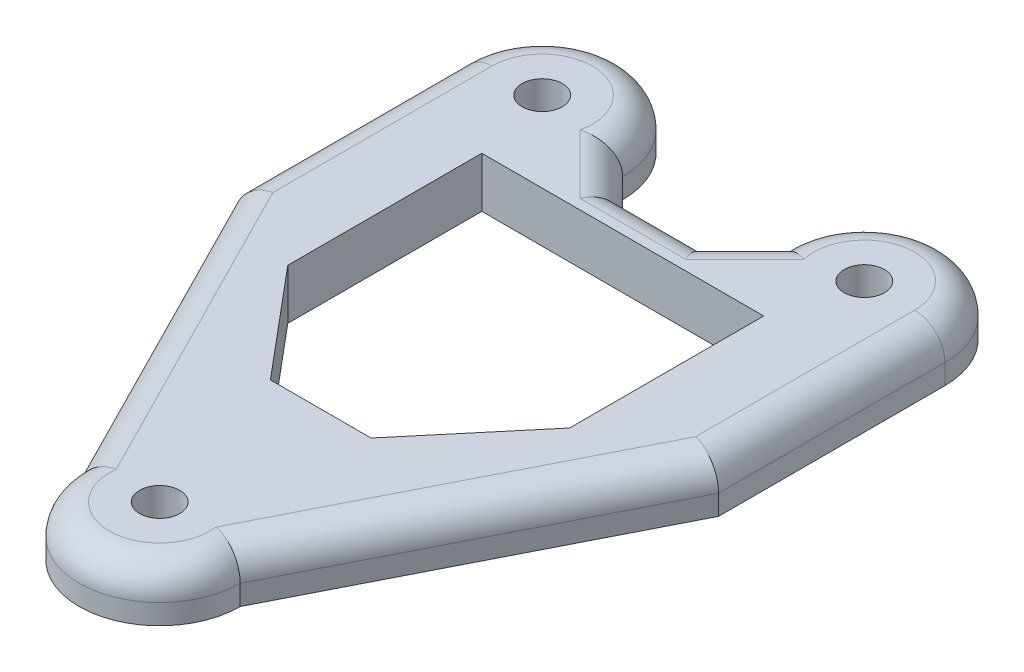
ISO-10303-21;
HEADER;
FILE_DESCRIPTION(('STEP AP214'),'2;1');
FILE_NAME('part.step','',(''),(''),'','','');
FILE_SCHEMA(('AUTOMOTIVE_DESIGN { 1 0 10303 214 1 1 1 1 }'));
ENDSEC;
DATA;
#1=APPLICATION_CONTEXT('core data for automotive mechanical design processes');
#2=APPLICATION_PROTOCOL_DEFINITION('international standard','automotive_design',2000,#1);
#3=PRODUCT_CONTEXT('',#1,'mechanical');
#4=PRODUCT('Part','Part','',(#3));
#5=PRODUCT_RELATED_PRODUCT_CATEGORY('part','',(#4));
#6=PRODUCT_DEFINITION_FORMATION('','',#4);
#7=PRODUCT_DEFINITION_CONTEXT('part definition',#1,'design');
#8=PRODUCT_DEFINITION('design','',#6,#7);
#9=PRODUCT_DEFINITION_SHAPE('','',#8);
#10=(LENGTH_UNIT() NAMED_UNIT(*) SI_UNIT(.MILLI.,.METRE.));
#11=(NAMED_UNIT(*) PLANE_ANGLE_UNIT() SI_UNIT($,.RADIAN.));
#12=(NAMED_UNIT(*) SI_UNIT($,.STERADIAN.) SOLID_ANGLE_UNIT());
#13=UNCERTAINTY_MEASURE_WITH_UNIT(LENGTH_MEASURE(1.E-05),#10,'distance_accuracy_value','');
#14=(GEOMETRIC_REPRESENTATION_CONTEXT(3) GLOBAL_UNCERTAINTY_ASSIGNED_CONTEXT((#13)) GLOBAL_UNIT_ASSIGNED_CONTEXT((#10,
#11,#12)) REPRESENTATION_CONTEXT('',''));
#15=CARTESIAN_POINT('',(0.,0.,0.));
#16=DIRECTION('',(0.,0.,1.));
#17=DIRECTION('',(1.,0.,0.));
#18=AXIS2_PLACEMENT_3D('',#15,#16,#17);
#19=CARTESIAN_POINT('',(19.2610001941112,5.,-9.77625473621242));
#20=DIRECTION('',(-0.891711743835329,0.,0.452603762585064));
#21=DIRECTION('',(0.452603762585064,0.,0.891711743835329));
#22=AXIS2_PLACEMENT_3D('',#19,#20,#21);
#23=PLANE('',#22);
#24=DIRECTION('',(0.,-1.,0.));
#25=VECTOR('',#24,1.);
#26=CARTESIAN_POINT('',(28.0819782521913,5.,7.60267663099086));
#27=LINE('',#26,#25);
#28=CARTESIAN_POINT('',(28.0819782521913,2.,7.60267663099086));
#29=VERTEX_POINT('',#28);
#30=CARTESIAN_POINT('',(28.0819782521913,0.,7.60267663099086));
#31=VERTEX_POINT('',#30);
#32=EDGE_CURVE('E340',#29,#31,#27,.T.);
#33=ORIENTED_EDGE('',*,*,#32,.F.);
#34=DIRECTION('',(-0.452603762585064,0.,-0.891711743835329));
#35=VECTOR('',#34,1.);
#36=CARTESIAN_POINT('',(19.2610001941112,2.,-9.77625473621242));
#37=LINE('',#36,#35);
#38=CARTESIAN_POINT('',(12.0819782521913,2.,-23.9202338721753));
#39=VERTEX_POINT('',#38);
#40=EDGE_CURVE('E406',#29,#39,#37,.T.);
#41=ORIENTED_EDGE('',*,*,#40,.T.);
#42=DIRECTION('',(0.,-1.,0.));
#43=VECTOR('',#42,1.);
#44=CARTESIAN_POINT('',(12.0819782521913,5.,-23.9202338721753));
#45=LINE('',#44,#43);
#46=CARTESIAN_POINT('',(12.0819782521913,0.,-23.9202338721753));
#47=VERTEX_POINT('',#46);
#48=EDGE_CURVE('E195',#39,#47,#45,.T.);
#49=ORIENTED_EDGE('',*,*,#48,.T.);
#50=DIRECTION('',(-0.452603762585064,0.,-0.891711743835329));
#51=VECTOR('',#50,1.);
#52=CARTESIAN_POINT('',(19.2610001941112,0.,-9.77625473621242));
#53=LINE('',#52,#51);
#54=EDGE_CURVE('E279',#31,#47,#53,.T.);
#55=ORIENTED_EDGE('',*,*,#54,.F.);
#56=EDGE_LOOP('',(#33,#41,#49,#55));
#57=FACE_BOUND('',#56,.T.);
#58=ADVANCED_FACE('F41',(#57),#23,.T.);
#59=CARTESIAN_POINT('',(36.0819782521913,5.,7.60267663099086));
#60=DIRECTION('',(0.,-1.,0.));
#61=DIRECTION('',(0.,0.,-1.));
#62=AXIS2_PLACEMENT_3D('',#59,#60,#61);
#63=CYLINDRICAL_SURFACE('',#62,8.);
#64=DIRECTION('',(0.,-1.,0.));
#65=VECTOR('',#64,1.);
#66=CARTESIAN_POINT('',(44.0819782521913,5.,7.60267663099086));
#67=LINE('',#66,#65);
#68=CARTESIAN_POINT('',(44.0819782521913,2.,7.60267663099086));
#69=VERTEX_POINT('',#68);
#70=CARTESIAN_POINT('',(44.0819782521913,0.,7.60267663099086));
#71=VERTEX_POINT('',#70);
#72=EDGE_CURVE('E337',#69,#71,#67,.T.);
#73=ORIENTED_EDGE('',*,*,#72,.F.);
#74=CARTESIAN_POINT('',(36.0819782521913,2.,7.60267663099086));
#75=DIRECTION('',(0.,1.,0.));
#76=DIRECTION('',(0.,0.,1.));
#77=AXIS2_PLACEMENT_3D('',#74,#75,#76);
#78=CIRCLE('',#77,8.);
#79=EDGE_CURVE('E409',#69,#29,#78,.F.);
#80=ORIENTED_EDGE('',*,*,#79,.T.);
#81=ORIENTED_EDGE('',*,*,#32,.T.);
#82=CARTESIAN_POINT('',(36.0819782521913,0.,7.60267663099086));
#83=DIRECTION('',(0.,1.,0.));
#84=DIRECTION('',(0.,0.,1.));
#85=AXIS2_PLACEMENT_3D('',#82,#83,#84);
#86=CIRCLE('',#85,8.);
#87=EDGE_CURVE('E283',#31,#71,#86,.T.);
#88=ORIENTED_EDGE('',*,*,#87,.T.);
#89=EDGE_LOOP('',(#73,#80,#81,#88));
#90=FACE_BOUND('',#89,.T.);
#91=ADVANCED_FACE('F494',(#90),#63,.T.);
#92=CARTESIAN_POINT('',(38.120157847904,5.,19.3485473210096));
#93=DIRECTION('',(-0.891711743835329,0.,-0.452603762585064));
#94=DIRECTION('',(-0.452603762585064,0.,0.891711743835329));
#95=AXIS2_PLACEMENT_3D('',#92,#93,#94);
#96=PLANE('',#95);
#97=DIRECTION('',(0.,-1.,0.));
#98=VECTOR('',#97,1.);
#99=CARTESIAN_POINT('',(60.0819782521913,5.,-23.9202338721754));
#100=LINE('',#99,#98);
#101=CARTESIAN_POINT('',(60.0819782521913,2.,-23.9202338721754));
#102=VERTEX_POINT('',#101);
#103=CARTESIAN_POINT('',(60.0819782521913,0.,-23.9202338721754));
#104=VERTEX_POINT('',#103);
#105=EDGE_CURVE('E334',#102,#104,#100,.T.);
#106=ORIENTED_EDGE('',*,*,#105,.F.);
#107=DIRECTION('',(0.452603762585064,0.,-0.891711743835329));
#108=VECTOR('',#107,1.);
#109=CARTESIAN_POINT('',(44.0819782521913,2.,7.60267663099086));
#110=LINE('',#109,#108);
#111=EDGE_CURVE('E51',#102,#69,#110,.F.);
#112=ORIENTED_EDGE('',*,*,#111,.T.);
#113=ORIENTED_EDGE('',*,*,#72,.T.);
#114=DIRECTION('',(0.452603762585064,0.,-0.891711743835329));
#115=VECTOR('',#114,1.);
#116=CARTESIAN_POINT('',(38.120157847904,0.,19.3485473210096));
#117=LINE('',#116,#115);
#118=EDGE_CURVE('E287',#71,#104,#117,.T.);
#119=ORIENTED_EDGE('',*,*,#118,.T.);
#120=EDGE_LOOP('',(#106,#112,#113,#119));
#121=FACE_BOUND('',#120,.T.);
#122=ADVANCED_FACE('F500',(#121),#96,.F.);
#123=CARTESIAN_POINT('',(60.0819782521913,5.,0.));
#124=DIRECTION('',(-1.,0.,0.));
#125=DIRECTION('',(0.,0.,1.));
#126=AXIS2_PLACEMENT_3D('',#123,#124,#125);
#127=PLANE('',#126);
#128=DIRECTION('',(0.,-1.,0.));
#129=VECTOR('',#128,1.);
#130=CARTESIAN_POINT('',(60.0819782521913,5.,-46.3973233690091));
#131=LINE('',#130,#129);
#132=CARTESIAN_POINT('',(60.0819782521913,2.,-46.3973233690091));
#133=VERTEX_POINT('',#132);
#134=CARTESIAN_POINT('',(60.0819782521913,0.,-46.3973233690091));
#135=VERTEX_POINT('',#134);
#136=EDGE_CURVE('E331',#133,#135,#131,.T.);
#137=ORIENTED_EDGE('',*,*,#136,.F.);
#138=DIRECTION('',(0.,0.,-1.));
#139=VECTOR('',#138,1.);
#140=CARTESIAN_POINT('',(60.0819782521913,2.,-23.9202338721754));
#141=LINE('',#140,#139);
#142=EDGE_CURVE('E11',#133,#102,#141,.F.);
#143=ORIENTED_EDGE('',*,*,#142,.T.);
#144=ORIENTED_EDGE('',*,*,#105,.T.);
#145=DIRECTION('',(0.,0.,-1.));
#146=VECTOR('',#145,1.);
#147=CARTESIAN_POINT('',(60.0819782521913,0.,0.));
#148=LINE('',#147,#146);
#149=EDGE_CURVE('E291',#104,#135,#148,.T.);
#150=ORIENTED_EDGE('',*,*,#149,.T.);
#151=EDGE_LOOP('',(#137,#143,#144,#150));
#152=FACE_BOUND('',#151,.T.);
#153=ADVANCED_FACE('F564',(#152),#127,.F.);
#154=CARTESIAN_POINT('',(52.0819782521913,5.,-46.3973233690091));
#155=DIRECTION('',(0.,-1.,0.));
#156=DIRECTION('',(0.,0.,-1.));
#157=AXIS2_PLACEMENT_3D('',#154,#155,#156);
#158=CYLINDRICAL_SURFACE('',#157,8.);
#159=DIRECTION('',(0.,-1.,0.));
#160=VECTOR('',#159,1.);
#161=CARTESIAN_POINT('',(44.0819782521913,5.,-46.3973233690091));
#162=LINE('',#161,#160);
#163=CARTESIAN_POINT('',(44.0819782521913,2.,-46.3973233690091));
#164=VERTEX_POINT('',#163);
#165=CARTESIAN_POINT('',(44.0819782521913,0.,-46.3973233690091));
#166=VERTEX_POINT('',#165);
#167=EDGE_CURVE('E328',#164,#166,#162,.T.);
#168=ORIENTED_EDGE('',*,*,#167,.F.);
#169=CARTESIAN_POINT('',(52.0819782521913,2.,-46.3973233690091));
#170=DIRECTION('',(0.,1.,0.));
#171=DIRECTION('',(0.,0.,1.));
#172=AXIS2_PLACEMENT_3D('',#169,#170,#171);
#173=CIRCLE('',#172,8.);
#174=EDGE_CURVE('E387',#164,#133,#173,.F.);
#175=ORIENTED_EDGE('',*,*,#174,.T.);
#176=ORIENTED_EDGE('',*,*,#136,.T.);
#177=CARTESIAN_POINT('',(52.0819782521913,0.,-46.3973233690091));
#178=DIRECTION('',(0.,1.,0.));
#179=DIRECTION('',(0.,0.,1.));
#180=AXIS2_PLACEMENT_3D('',#177,#178,#179);
#181=CIRCLE('',#180,8.);
#182=EDGE_CURVE('E295',#135,#166,#181,.T.);
#183=ORIENTED_EDGE('',*,*,#182,.T.);
#184=EDGE_LOOP('',(#168,#175,#176,#183));
#185=FACE_BOUND('',#184,.T.);
#186=ADVANCED_FACE('F560',(#185),#158,.T.);
#187=CARTESIAN_POINT('',(-1.15767255840897,5.,-1.15767255840897));
#188=DIRECTION('',(-0.707106781186547,0.,-0.707106781186548));
#189=DIRECTION('',(-0.707106781186548,0.,0.707106781186547));
#190=AXIS2_PLACEMENT_3D('',#187,#188,#189);
#191=PLANE('',#190);
#192=DIRECTION('',(0.,-1.,0.));
#193=VECTOR('',#192,1.);
#194=CARTESIAN_POINT('',(40.0819782521913,5.,-42.3973233690092));
#195=LINE('',#194,#193);
#196=CARTESIAN_POINT('',(40.0819782521913,2.,-42.3973233690092));
#197=VERTEX_POINT('',#196);
#198=CARTESIAN_POINT('',(40.0819782521913,0.,-42.3973233690092));
#199=VERTEX_POINT('',#198);
#200=EDGE_CURVE('E325',#197,#199,#195,.T.);
#201=ORIENTED_EDGE('',*,*,#200,.F.);
#202=DIRECTION('',(0.707106781186548,0.,-0.707106781186547));
#203=VECTOR('',#202,1.);
#204=CARTESIAN_POINT('',(-1.15767255840897,2.,-1.15767255840897));
#205=LINE('',#204,#203);
#206=EDGE_CURVE('E391',#197,#164,#205,.T.);
#207=ORIENTED_EDGE('',*,*,#206,.T.);
#208=ORIENTED_EDGE('',*,*,#167,.T.);
#209=DIRECTION('',(0.707106781186548,0.,-0.707106781186547));
#210=VECTOR('',#209,1.);
#211=CARTESIAN_POINT('',(-1.15767255840897,0.,-1.15767255840897));
#212=LINE('',#211,#210);
#213=EDGE_CURVE('E299',#199,#166,#212,.T.);
#214=ORIENTED_EDGE('',*,*,#213,.F.);
#215=EDGE_LOOP('',(#201,#207,#208,#214));
#216=FACE_BOUND('',#215,.T.);
#217=ADVANCED_FACE('F556',(#216),#191,.T.);
#218=CARTESIAN_POINT('',(0.,5.,-42.3973233690092));
#219=DIRECTION('',(0.,0.,-1.));
#220=DIRECTION('',(-1.,0.,0.));
#221=AXIS2_PLACEMENT_3D('',#218,#219,#220);
#222=PLANE('',#221);
#223=DIRECTION('',(0.,-1.,0.));
#224=VECTOR('',#223,1.);
#225=CARTESIAN_POINT('',(32.0819782521913,5.,-42.3973233690092));
#226=LINE('',#225,#224);
#227=CARTESIAN_POINT('',(32.0819782521913,2.,-42.3973233690092));
#228=VERTEX_POINT('',#227);
#229=CARTESIAN_POINT('',(32.0819782521913,0.,-42.3973233690092));
#230=VERTEX_POINT('',#229);
#231=EDGE_CURVE('E322',#228,#230,#226,.T.);
#232=ORIENTED_EDGE('',*,*,#231,.F.);
#233=DIRECTION('',(1.,0.,0.));
#234=VECTOR('',#233,1.);
#235=CARTESIAN_POINT('',(0.,2.,-42.3973233690092));
#236=LINE('',#235,#234);
#237=EDGE_CURVE('E394',#228,#197,#236,.T.);
#238=ORIENTED_EDGE('',*,*,#237,.T.);
#239=ORIENTED_EDGE('',*,*,#200,.T.);
#240=DIRECTION('',(1.,0.,0.));
#241=VECTOR('',#240,1.);
#242=CARTESIAN_POINT('',(0.,0.,-42.3973233690092));
#243=LINE('',#242,#241);
#244=EDGE_CURVE('E303',#230,#199,#243,.T.);
#245=ORIENTED_EDGE('',*,*,#244,.F.);
#246=EDGE_LOOP('',(#232,#238,#239,#245));
#247=FACE_BOUND('',#246,.T.);
#248=ADVANCED_FACE('F547',(#247),#222,.T.);
#249=CARTESIAN_POINT('',(37.2396508106002,5.,-37.2396508106003));
#250=DIRECTION('',(0.707106781186547,0.,-0.707106781186548));
#251=DIRECTION('',(-0.707106781186548,0.,-0.707106781186547));
#252=AXIS2_PLACEMENT_3D('',#249,#250,#251);
#253=PLANE('',#252);
#254=DIRECTION('',(0.,-1.,0.));
#255=VECTOR('',#254,1.);
#256=CARTESIAN_POINT('',(28.0819782521913,5.,-46.3973233690091));
#257=LINE('',#256,#255);
#258=CARTESIAN_POINT('',(28.0819782521913,2.,-46.3973233690091));
#259=VERTEX_POINT('',#258);
#260=CARTESIAN_POINT('',(28.0819782521913,0.,-46.3973233690091));
#261=VERTEX_POINT('',#260);
#262=EDGE_CURVE('E319',#259,#261,#257,.T.);
#263=ORIENTED_EDGE('',*,*,#262,.F.);
#264=DIRECTION('',(0.707106781186548,0.,0.707106781186547));
#265=VECTOR('',#264,1.);
#266=CARTESIAN_POINT('',(37.2396508106002,2.,-37.2396508106003));
#267=LINE('',#266,#265);
#268=EDGE_CURVE('E397',#259,#228,#267,.T.);
#269=ORIENTED_EDGE('',*,*,#268,.T.);
#270=ORIENTED_EDGE('',*,*,#231,.T.);
#271=DIRECTION('',(0.707106781186548,0.,0.707106781186547));
#272=VECTOR('',#271,1.);
#273=CARTESIAN_POINT('',(37.2396508106002,0.,-37.2396508106003));
#274=LINE('',#273,#272);
#275=EDGE_CURVE('E307',#261,#230,#274,.T.);
#276=ORIENTED_EDGE('',*,*,#275,.F.);
#277=EDGE_LOOP('',(#263,#269,#270,#276));
#278=FACE_BOUND('',#277,.T.);
#279=ADVANCED_FACE('F541',(#278),#253,.T.);
#280=CARTESIAN_POINT('',(20.0819782521913,5.,-46.3973233690091));
#281=DIRECTION('',(0.,-1.,0.));
#282=DIRECTION('',(0.,0.,-1.));
#283=AXIS2_PLACEMENT_3D('',#280,#281,#282);
#284=CYLINDRICAL_SURFACE('',#283,7.99999999999999);
#285=DIRECTION('',(0.,-1.,0.));
#286=VECTOR('',#285,1.);
#287=CARTESIAN_POINT('',(12.0819782521913,5.,-46.3973233690091));
#288=LINE('',#287,#286);
#289=CARTESIAN_POINT('',(12.0819782521913,2.,-46.3973233690091));
#290=VERTEX_POINT('',#289);
#291=CARTESIAN_POINT('',(12.0819782521913,0.,-46.3973233690091));
#292=VERTEX_POINT('',#291);
#293=EDGE_CURVE('E316',#290,#292,#288,.T.);
#294=ORIENTED_EDGE('',*,*,#293,.F.);
#295=CARTESIAN_POINT('',(20.0819782521913,2.,-46.3973233690091));
#296=DIRECTION('',(0.,1.,0.));
#297=DIRECTION('',(0.,0.,1.));
#298=AXIS2_PLACEMENT_3D('',#295,#296,#297);
#299=CIRCLE('',#298,7.99999999999999);
#300=EDGE_CURVE('E400',#290,#259,#299,.F.);
#301=ORIENTED_EDGE('',*,*,#300,.T.);
#302=ORIENTED_EDGE('',*,*,#262,.T.);
#303=CARTESIAN_POINT('',(20.0819782521913,0.,-46.3973233690091));
#304=DIRECTION('',(0.,1.,0.));
#305=DIRECTION('',(0.,0.,1.));
#306=AXIS2_PLACEMENT_3D('',#303,#304,#305);
#307=CIRCLE('',#306,7.99999999999999);
#308=EDGE_CURVE('E218',#261,#292,#307,.T.);
#309=ORIENTED_EDGE('',*,*,#308,.T.);
#310=EDGE_LOOP('',(#294,#301,#302,#309));
#311=FACE_BOUND('',#310,.T.);
#312=ADVANCED_FACE('F537',(#311),#284,.T.);
#313=CARTESIAN_POINT('',(22.0819782521913,5.,0.));
#314=DIRECTION('',(1.,0.,0.));
#315=DIRECTION('',(0.,0.,-1.));
#316=AXIS2_PLACEMENT_3D('',#313,#314,#315);
#317=PLANE('',#316);
#318=DIRECTION('',(0.,0.,1.));
#319=VECTOR('',#318,1.);
#320=CARTESIAN_POINT('',(22.0819782521913,0.,0.));
#321=LINE('',#320,#319);
#322=CARTESIAN_POINT('',(22.0819782521913,0.,-38.3973233690091));
#323=VERTEX_POINT('',#322);
#324=CARTESIAN_POINT('',(22.0819782521913,0.,-19.1231057023571));
#325=VERTEX_POINT('',#324);
#326=EDGE_CURVE('E191',#323,#325,#321,.T.);
#327=ORIENTED_EDGE('',*,*,#326,.F.);
#328=DIRECTION('',(0.,-1.,0.));
#329=VECTOR('',#328,1.);
#330=CARTESIAN_POINT('',(22.0819782521913,5.,-38.3973233690091));
#331=LINE('',#330,#329);
#332=CARTESIAN_POINT('',(22.0819782521913,5.,-38.3973233690091));
#333=VERTEX_POINT('',#332);
#334=EDGE_CURVE('E185',#333,#323,#331,.T.);
#335=ORIENTED_EDGE('',*,*,#334,.F.);
#336=DIRECTION('',(0.,0.,1.));
#337=VECTOR('',#336,1.);
#338=CARTESIAN_POINT('',(22.0819782521913,5.,0.));
#339=LINE('',#338,#337);
#340=CARTESIAN_POINT('',(22.0819782521913,5.,-19.1231057023571));
#341=VERTEX_POINT('',#340);
#342=EDGE_CURVE('E189',#333,#341,#339,.T.);
#343=ORIENTED_EDGE('',*,*,#342,.T.);
#344=DIRECTION('',(0.,-1.,0.));
#345=VECTOR('',#344,1.);
#346=CARTESIAN_POINT('',(22.0819782521913,5.,-19.1231057023571));
#347=LINE('',#346,#345);
#348=EDGE_CURVE('E245',#341,#325,#347,.T.);
#349=ORIENTED_EDGE('',*,*,#348,.T.);
#350=EDGE_LOOP('',(#327,#335,#343,#349));
#351=FACE_BOUND('',#350,.T.);
#352=ADVANCED_FACE('F187',(#351),#317,.T.);
#353=CARTESIAN_POINT('',(0.,5.,-38.3973233690091));
#354=DIRECTION('',(0.,0.,-1.));
#355=DIRECTION('',(-1.,0.,0.));
#356=AXIS2_PLACEMENT_3D('',#353,#354,#355);
#357=PLANE('',#356);
#358=DIRECTION('',(1.,0.,0.));
#359=VECTOR('',#358,1.);
#360=CARTESIAN_POINT('',(0.,0.,-38.3973233690091));
#361=LINE('',#360,#359);
#362=CARTESIAN_POINT('',(50.0819782521913,0.,-38.3973233690091));
#363=VERTEX_POINT('',#362);
#364=EDGE_CURVE('E248',#323,#363,#361,.T.);
#365=ORIENTED_EDGE('',*,*,#364,.T.);
#366=DIRECTION('',(0.,-1.,0.));
#367=VECTOR('',#366,1.);
#368=CARTESIAN_POINT('',(50.0819782521913,5.,-38.3973233690091));
#369=LINE('',#368,#367);
#370=CARTESIAN_POINT('',(50.0819782521913,5.,-38.3973233690091));
#371=VERTEX_POINT('',#370);
#372=EDGE_CURVE('E196',#371,#363,#369,.T.);
#373=ORIENTED_EDGE('',*,*,#372,.F.);
#374=DIRECTION('',(1.,0.,0.));
#375=VECTOR('',#374,1.);
#376=CARTESIAN_POINT('',(0.,5.,-38.3973233690091));
#377=LINE('',#376,#375);
#378=EDGE_CURVE('E199',#333,#371,#377,.T.);
#379=ORIENTED_EDGE('',*,*,#378,.F.);
#380=ORIENTED_EDGE('',*,*,#334,.T.);
#381=EDGE_LOOP('',(#365,#373,#379,#380));
#382=FACE_BOUND('',#381,.T.);
#383=ADVANCED_FACE('F200',(#382),#357,.F.);
#384=CARTESIAN_POINT('',(50.0819782521913,5.,0.));
#385=DIRECTION('',(1.,0.,0.));
#386=DIRECTION('',(0.,0.,-1.));
#387=AXIS2_PLACEMENT_3D('',#384,#385,#386);
#388=PLANE('',#387);
#389=DIRECTION('',(0.,0.,1.));
#390=VECTOR('',#389,1.);
#391=CARTESIAN_POINT('',(50.0819782521913,0.,0.));
#392=LINE('',#391,#390);
#393=CARTESIAN_POINT('',(50.0819782521913,0.,-19.1231057023571));
#394=VERTEX_POINT('',#393);
#395=EDGE_CURVE('E251',#363,#394,#392,.T.);
#396=ORIENTED_EDGE('',*,*,#395,.T.);
#397=DIRECTION('',(0.,-1.,0.));
#398=VECTOR('',#397,1.);
#399=CARTESIAN_POINT('',(50.0819782521913,5.,-19.1231057023571));
#400=LINE('',#399,#398);
#401=CARTESIAN_POINT('',(50.0819782521913,5.,-19.1231057023571));
#402=VERTEX_POINT('',#401);
#403=EDGE_CURVE('E352',#402,#394,#400,.T.);
#404=ORIENTED_EDGE('',*,*,#403,.F.);
#405=DIRECTION('',(0.,0.,1.));
#406=VECTOR('',#405,1.);
#407=CARTESIAN_POINT('',(50.0819782521913,5.,0.));
#408=LINE('',#407,#406);
#409=EDGE_CURVE('E205',#371,#402,#408,.T.);
#410=ORIENTED_EDGE('',*,*,#409,.F.);
#411=ORIENTED_EDGE('',*,*,#372,.T.);
#412=EDGE_LOOP('',(#396,#404,#410,#411));
#413=FACE_BOUND('',#412,.T.);
#414=ADVANCED_FACE('F530',(#413),#388,.F.);
#415=CARTESIAN_POINT('',(19.9730198761431,5.,16.7593536115681));
#416=DIRECTION('',(-0.766044443118979,0.,-0.642787609686538));
#417=DIRECTION('',(-0.642787609686538,0.,0.766044443118979));
#418=AXIS2_PLACEMENT_3D('',#415,#416,#417);
#419=PLANE('',#418);
#420=DIRECTION('',(0.642787609686538,0.,-0.766044443118979));
#421=VECTOR('',#420,1.);
#422=CARTESIAN_POINT('',(19.9730198761431,0.,16.7593536115681));
#423=LINE('',#422,#421);
#424=CARTESIAN_POINT('',(41.0819782521913,0.,-8.39732336900913));
#425=VERTEX_POINT('',#424);
#426=EDGE_CURVE('E255',#425,#394,#423,.T.);
#427=ORIENTED_EDGE('',*,*,#426,.F.);
#428=DIRECTION('',(0.,-1.,0.));
#429=VECTOR('',#428,1.);
#430=CARTESIAN_POINT('',(41.0819782521913,5.,-8.39732336900913));
#431=LINE('',#430,#429);
#432=CARTESIAN_POINT('',(41.0819782521913,5.,-8.39732336900913));
#433=VERTEX_POINT('',#432);
#434=EDGE_CURVE('E349',#433,#425,#431,.T.);
#435=ORIENTED_EDGE('',*,*,#434,.F.);
#436=DIRECTION('',(0.642787609686538,0.,-0.766044443118979));
#437=VECTOR('',#436,1.);
#438=CARTESIAN_POINT('',(19.9730198761431,5.,16.7593536115681));
#439=LINE('',#438,#437);
#440=EDGE_CURVE('E223',#433,#402,#439,.T.);
#441=ORIENTED_EDGE('',*,*,#440,.T.);
#442=ORIENTED_EDGE('',*,*,#403,.T.);
#443=EDGE_LOOP('',(#427,#435,#441,#442));
#444=FACE_BOUND('',#443,.T.);
#445=ADVANCED_FACE('F526',(#444),#419,.T.);
#446=CARTESIAN_POINT('',(0.,5.,-8.39732336900923));
#447=DIRECTION('',(0.,0.,-1.));
#448=DIRECTION('',(-1.,0.,0.));
#449=AXIS2_PLACEMENT_3D('',#446,#447,#448);
#450=PLANE('',#449);
#451=DIRECTION('',(1.,0.,0.));
#452=VECTOR('',#451,1.);
#453=CARTESIAN_POINT('',(0.,0.,-8.39732336900923));
#454=LINE('',#453,#452);
#455=CARTESIAN_POINT('',(31.0819782521913,0.,-8.39732336900913));
#456=VERTEX_POINT('',#455);
#457=EDGE_CURVE('E259',#456,#425,#454,.T.);
#458=ORIENTED_EDGE('',*,*,#457,.F.);
#459=DIRECTION('',(0.,-1.,0.));
#460=VECTOR('',#459,1.);
#461=CARTESIAN_POINT('',(31.0819782521913,5.,-8.39732336900913));
#462=LINE('',#461,#460);
#463=CARTESIAN_POINT('',(31.0819782521913,5.,-8.39732336900913));
#464=VERTEX_POINT('',#463);
#465=EDGE_CURVE('E346',#464,#456,#462,.T.);
#466=ORIENTED_EDGE('',*,*,#465,.F.);
#467=DIRECTION('',(1.,0.,0.));
#468=VECTOR('',#467,1.);
#469=CARTESIAN_POINT('',(0.,5.,-8.39732336900923));
#470=LINE('',#469,#468);
#471=EDGE_CURVE('E227',#464,#433,#470,.T.);
#472=ORIENTED_EDGE('',*,*,#471,.T.);
#473=ORIENTED_EDGE('',*,*,#434,.T.);
#474=EDGE_LOOP('',(#458,#466,#472,#473));
#475=FACE_BOUND('',#474,.T.);
#476=ADVANCED_FACE('F510',(#475),#450,.T.);
#477=CARTESIAN_POINT('',(36.0819782521913,5.,7.60267663099086));
#478=DIRECTION('',(0.,-1.,0.));
#479=DIRECTION('',(0.,0.,-1.));
#480=AXIS2_PLACEMENT_3D('',#477,#478,#479);
#481=CYLINDRICAL_SURFACE('',#480,2.);
#482=CARTESIAN_POINT('',(36.0819782521913,5.,7.60267663099086));
#483=DIRECTION('',(0.,1.,0.));
#484=DIRECTION('',(0.,0.,1.));
#485=AXIS2_PLACEMENT_3D('',#482,#483,#484);
#486=CIRCLE('',#485,2.);
#487=CARTESIAN_POINT('',(36.0819782521913,5.,9.60267663099086));
#488=VERTEX_POINT('',#487);
#489=EDGE_CURVE('E241',#488,#488,#486,.T.);
#490=ORIENTED_EDGE('',*,*,#489,.T.);
#491=EDGE_LOOP('',(#490));
#492=FACE_BOUND('',#491,.T.);
#493=CARTESIAN_POINT('',(36.0819782521913,0.,7.60267663099086));
#494=DIRECTION('',(0.,1.,0.));
#495=DIRECTION('',(0.,0.,1.));
#496=AXIS2_PLACEMENT_3D('',#493,#494,#495);
#497=CIRCLE('',#496,2.);
#498=CARTESIAN_POINT('',(36.0819782521913,0.,9.60267663099086));
#499=VERTEX_POINT('',#498);
#500=EDGE_CURVE('E275',#499,#499,#497,.T.);
#501=ORIENTED_EDGE('',*,*,#500,.F.);
#502=EDGE_LOOP('',(#501));
#503=FACE_BOUND('',#502,.T.);
#504=ADVANCED_FACE('F506',(#492,#503),#481,.F.);
#505=CARTESIAN_POINT('',(20.0819782521913,5.,-46.3973233690091));
#506=DIRECTION('',(0.,-1.,0.));
#507=DIRECTION('',(0.,0.,-1.));
#508=AXIS2_PLACEMENT_3D('',#505,#506,#507);
#509=CYLINDRICAL_SURFACE('',#508,2.);
#510=CARTESIAN_POINT('',(20.0819782521913,5.,-46.3973233690091));
#511=DIRECTION('',(0.,1.,0.));
#512=DIRECTION('',(0.,0.,1.));
#513=AXIS2_PLACEMENT_3D('',#510,#511,#512);
#514=CIRCLE('',#513,2.);
#515=CARTESIAN_POINT('',(20.0819782521913,5.,-44.3973233690091));
#516=VERTEX_POINT('',#515);
#517=EDGE_CURVE('E237',#516,#516,#514,.T.);
#518=ORIENTED_EDGE('',*,*,#517,.T.);
#519=EDGE_LOOP('',(#518));
#520=FACE_BOUND('',#519,.T.);
#521=CARTESIAN_POINT('',(20.0819782521913,0.,-46.3973233690091));
#522=DIRECTION('',(0.,1.,0.));
#523=DIRECTION('',(0.,0.,1.));
#524=AXIS2_PLACEMENT_3D('',#521,#522,#523);
#525=CIRCLE('',#524,2.);
#526=CARTESIAN_POINT('',(20.0819782521913,0.,-44.3973233690091));
#527=VERTEX_POINT('',#526);
#528=EDGE_CURVE('E271',#527,#527,#525,.T.);
#529=ORIENTED_EDGE('',*,*,#528,.F.);
#530=EDGE_LOOP('',(#529));
#531=FACE_BOUND('',#530,.T.);
#532=ADVANCED_FACE('F509',(#520,#531),#509,.F.);
#533=CARTESIAN_POINT('',(52.0819782521913,5.,-46.3973233690091));
#534=DIRECTION('',(0.,-1.,0.));
#535=DIRECTION('',(0.,0.,-1.));
#536=AXIS2_PLACEMENT_3D('',#533,#534,#535);
#537=CYLINDRICAL_SURFACE('',#536,2.);
#538=CARTESIAN_POINT('',(52.0819782521913,5.,-46.3973233690091));
#539=DIRECTION('',(0.,1.,0.));
#540=DIRECTION('',(0.,0.,1.));
#541=AXIS2_PLACEMENT_3D('',#538,#539,#540);
#542=CIRCLE('',#541,2.);
#543=CARTESIAN_POINT('',(52.0819782521913,5.,-44.3973233690091));
#544=VERTEX_POINT('',#543);
#545=EDGE_CURVE('E233',#544,#544,#542,.T.);
#546=ORIENTED_EDGE('',*,*,#545,.T.);
#547=EDGE_LOOP('',(#546));
#548=FACE_BOUND('',#547,.T.);
#549=CARTESIAN_POINT('',(52.0819782521913,0.,-46.3973233690091));
#550=DIRECTION('',(0.,1.,0.));
#551=DIRECTION('',(0.,0.,1.));
#552=AXIS2_PLACEMENT_3D('',#549,#550,#551);
#553=CIRCLE('',#552,2.);
#554=CARTESIAN_POINT('',(52.0819782521913,0.,-44.3973233690091));
#555=VERTEX_POINT('',#554);
#556=EDGE_CURVE('E267',#555,#555,#553,.T.);
#557=ORIENTED_EDGE('',*,*,#556,.F.);
#558=EDGE_LOOP('',(#557));
#559=FACE_BOUND('',#558,.T.);
#560=ADVANCED_FACE('F514',(#548,#559),#537,.F.);
#561=CARTESIAN_POINT('',(22.3745281461592,5.,-18.7744583152078));
#562=DIRECTION('',(-0.766044443118979,0.,0.642787609686538));
#563=DIRECTION('',(0.642787609686538,0.,0.766044443118979));
#564=AXIS2_PLACEMENT_3D('',#561,#562,#563);
#565=PLANE('',#564);
#566=DIRECTION('',(-0.642787609686538,0.,-0.766044443118979));
#567=VECTOR('',#566,1.);
#568=CARTESIAN_POINT('',(22.3745281461592,0.,-18.7744583152078));
#569=LINE('',#568,#567);
#570=EDGE_CURVE('E263',#456,#325,#569,.T.);
#571=ORIENTED_EDGE('',*,*,#570,.T.);
#572=ORIENTED_EDGE('',*,*,#348,.F.);
#573=DIRECTION('',(-0.642787609686538,0.,-0.766044443118979));
#574=VECTOR('',#573,1.);
#575=CARTESIAN_POINT('',(22.3745281461592,5.,-18.7744583152078));
#576=LINE('',#575,#574);
#577=EDGE_CURVE('E211',#464,#341,#576,.T.);
#578=ORIENTED_EDGE('',*,*,#577,.F.);
#579=ORIENTED_EDGE('',*,*,#465,.T.);
#580=EDGE_LOOP('',(#571,#572,#578,#579));
#581=FACE_BOUND('',#580,.T.);
#582=ADVANCED_FACE('F518',(#581),#565,.F.);
#583=CARTESIAN_POINT('',(12.0819782521913,5.,0.));
#584=DIRECTION('',(-1.,0.,0.));
#585=DIRECTION('',(0.,0.,1.));
#586=AXIS2_PLACEMENT_3D('',#583,#584,#585);
#587=PLANE('',#586);
#588=ORIENTED_EDGE('',*,*,#48,.F.);
#589=DIRECTION('',(0.,0.,-1.));
#590=VECTOR('',#589,1.);
#591=CARTESIAN_POINT('',(12.0819782521913,2.,0.));
#592=LINE('',#591,#590);
#593=EDGE_CURVE('E403',#39,#290,#592,.T.);
#594=ORIENTED_EDGE('',*,*,#593,.T.);
#595=ORIENTED_EDGE('',*,*,#293,.T.);
#596=DIRECTION('',(0.,0.,-1.));
#597=VECTOR('',#596,1.);
#598=CARTESIAN_POINT('',(12.0819782521913,0.,0.));
#599=LINE('',#598,#597);
#600=EDGE_CURVE('E214',#47,#292,#599,.T.);
#601=ORIENTED_EDGE('',*,*,#600,.F.);
#602=EDGE_LOOP('',(#588,#594,#595,#601));
#603=FACE_BOUND('',#602,.T.);
#604=ADVANCED_FACE('F522',(#603),#587,.T.);
#605=CARTESIAN_POINT('',(0.,5.,0.));
#606=DIRECTION('',(0.,1.,0.));
#607=DIRECTION('',(0.,0.,1.));
#608=AXIS2_PLACEMENT_3D('',#605,#606,#607);
#609=PLANE('',#608);
#610=DIRECTION('',(0.,0.,-1.));
#611=VECTOR('',#610,1.);
#612=CARTESIAN_POINT('',(57.0819782521913,5.,-46.3973233690091));
#613=LINE('',#612,#611);
#614=CARTESIAN_POINT('',(57.0819782521913,5.,-24.6380024710012));
#615=VERTEX_POINT('',#614);
#616=CARTESIAN_POINT('',(57.0819782521913,5.,-46.3973233690091));
#617=VERTEX_POINT('',#616);
#618=EDGE_CURVE('E343',#615,#617,#613,.T.);
#619=ORIENTED_EDGE('',*,*,#618,.T.);
#620=CARTESIAN_POINT('',(52.0819782521913,5.,-46.3973233690091));
#621=DIRECTION('',(0.,1.,0.));
#622=DIRECTION('',(0.,0.,1.));
#623=AXIS2_PLACEMENT_3D('',#620,#621,#622);
#624=CIRCLE('',#623,5.);
#625=CARTESIAN_POINT('',(47.2082088227262,5.,-45.2809132524248));
#626=VERTEX_POINT('',#625);
#627=EDGE_CURVE('E383',#617,#626,#624,.T.);
#628=ORIENTED_EDGE('',*,*,#627,.T.);
#629=DIRECTION('',(0.707106781186548,0.,-0.707106781186547));
#630=VECTOR('',#629,1.);
#631=CARTESIAN_POINT('',(0.963647785150668,5.,0.96364778515067));
#632=LINE('',#631,#630);
#633=CARTESIAN_POINT('',(41.3246189393106,5.,-39.3973233690092));
#634=VERTEX_POINT('',#633);
#635=EDGE_CURVE('E380',#626,#634,#632,.F.);
#636=ORIENTED_EDGE('',*,*,#635,.T.);
#637=DIRECTION('',(1.,0.,0.));
#638=VECTOR('',#637,1.);
#639=CARTESIAN_POINT('',(0.,5.,-39.3973233690092));
#640=LINE('',#639,#638);
#641=CARTESIAN_POINT('',(30.839337565072,5.,-39.3973233690092));
#642=VERTEX_POINT('',#641);
#643=EDGE_CURVE('E377',#634,#642,#640,.F.);
#644=ORIENTED_EDGE('',*,*,#643,.T.);
#645=DIRECTION('',(0.707106781186548,0.,0.707106781186547));
#646=VECTOR('',#645,1.);
#647=CARTESIAN_POINT('',(35.1183304670406,5.,-35.1183304670406));
#648=LINE('',#647,#646);
#649=CARTESIAN_POINT('',(24.9557476816564,5.,-45.2809132524248));
#650=VERTEX_POINT('',#649);
#651=EDGE_CURVE('E374',#642,#650,#648,.F.);
#652=ORIENTED_EDGE('',*,*,#651,.T.);
#653=CARTESIAN_POINT('',(20.0819782521913,5.,-46.3973233690091));
#654=DIRECTION('',(0.,1.,0.));
#655=DIRECTION('',(0.,0.,1.));
#656=AXIS2_PLACEMENT_3D('',#653,#654,#655);
#657=CIRCLE('',#656,4.99999999999999);
#658=CARTESIAN_POINT('',(15.0819782521913,5.,-46.3973233690091));
#659=VERTEX_POINT('',#658);
#660=EDGE_CURVE('E371',#650,#659,#657,.T.);
#661=ORIENTED_EDGE('',*,*,#660,.T.);
#662=DIRECTION('',(0.,0.,-1.));
#663=VECTOR('',#662,1.);
#664=CARTESIAN_POINT('',(15.0819782521913,5.,0.));
#665=LINE('',#664,#663);
#666=CARTESIAN_POINT('',(15.0819782521913,5.,-24.6380024710013));
#667=VERTEX_POINT('',#666);
#668=EDGE_CURVE('E368',#659,#667,#665,.F.);
#669=ORIENTED_EDGE('',*,*,#668,.T.);
#670=DIRECTION('',(-0.452603762585064,0.,-0.891711743835329));
#671=VECTOR('',#670,1.);
#672=CARTESIAN_POINT('',(21.9361354256172,5.,-11.1340660239676));
#673=LINE('',#672,#671);
#674=CARTESIAN_POINT('',(31.1227721784717,5.,6.96527948761562));
#675=VERTEX_POINT('',#674);
#676=EDGE_CURVE('E365',#667,#675,#673,.F.);
#677=ORIENTED_EDGE('',*,*,#676,.T.);
#678=CARTESIAN_POINT('',(36.0819782521913,5.,7.60267663099086));
#679=DIRECTION('',(0.,1.,0.));
#680=DIRECTION('',(0.,0.,1.));
#681=AXIS2_PLACEMENT_3D('',#678,#679,#680);
#682=CIRCLE('',#681,5.);
#683=CARTESIAN_POINT('',(41.0411843259109,5.,6.96527948761562));
#684=VERTEX_POINT('',#683);
#685=EDGE_CURVE('E362',#675,#684,#682,.T.);
#686=ORIENTED_EDGE('',*,*,#685,.T.);
#687=DIRECTION('',(0.452603762585064,0.,-0.891711743835329));
#688=VECTOR('',#687,1.);
#689=CARTESIAN_POINT('',(57.4068430206853,5.,-25.2780451599306));
#690=LINE('',#689,#688);
#691=EDGE_CURVE('E359',#684,#615,#690,.T.);
#692=ORIENTED_EDGE('',*,*,#691,.T.);
#693=EDGE_LOOP('',(#619,#628,#636,#644,#652,#661,#669,#677,#686,#692));
#694=FACE_BOUND('',#693,.T.);
#695=ORIENTED_EDGE('',*,*,#342,.F.);
#696=ORIENTED_EDGE('',*,*,#378,.T.);
#697=ORIENTED_EDGE('',*,*,#409,.T.);
#698=ORIENTED_EDGE('',*,*,#440,.F.);
#699=ORIENTED_EDGE('',*,*,#471,.F.);
#700=ORIENTED_EDGE('',*,*,#577,.T.);
#701=EDGE_LOOP('',(#695,#696,#697,#698,#699,#700));
#702=FACE_BOUND('',#701,.T.);
#703=ORIENTED_EDGE('',*,*,#545,.F.);
#704=EDGE_LOOP('',(#703));
#705=FACE_BOUND('',#704,.T.);
#706=ORIENTED_EDGE('',*,*,#517,.F.);
#707=EDGE_LOOP('',(#706));
#708=FACE_BOUND('',#707,.T.);
#709=ORIENTED_EDGE('',*,*,#489,.F.);
#710=EDGE_LOOP('',(#709));
#711=FACE_BOUND('',#710,.T.);
#712=ADVANCED_FACE('F207',(#694,#702,#705,#708,#711),#609,.T.);
#713=CARTESIAN_POINT('',(0.,0.,0.));
#714=DIRECTION('',(0.,1.,0.));
#715=DIRECTION('',(0.,0.,1.));
#716=AXIS2_PLACEMENT_3D('',#713,#714,#715);
#717=PLANE('',#716);
#718=ORIENTED_EDGE('',*,*,#326,.T.);
#719=ORIENTED_EDGE('',*,*,#570,.F.);
#720=ORIENTED_EDGE('',*,*,#457,.T.);
#721=ORIENTED_EDGE('',*,*,#426,.T.);
#722=ORIENTED_EDGE('',*,*,#395,.F.);
#723=ORIENTED_EDGE('',*,*,#364,.F.);
#724=EDGE_LOOP('',(#718,#719,#720,#721,#722,#723));
#725=FACE_BOUND('',#724,.T.);
#726=ORIENTED_EDGE('',*,*,#556,.T.);
#727=EDGE_LOOP('',(#726));
#728=FACE_BOUND('',#727,.T.);
#729=ORIENTED_EDGE('',*,*,#528,.T.);
#730=EDGE_LOOP('',(#729));
#731=FACE_BOUND('',#730,.T.);
#732=ORIENTED_EDGE('',*,*,#500,.T.);
#733=EDGE_LOOP('',(#732));
#734=FACE_BOUND('',#733,.T.);
#735=ORIENTED_EDGE('',*,*,#54,.T.);
#736=ORIENTED_EDGE('',*,*,#600,.T.);
#737=ORIENTED_EDGE('',*,*,#308,.F.);
#738=ORIENTED_EDGE('',*,*,#275,.T.);
#739=ORIENTED_EDGE('',*,*,#244,.T.);
#740=ORIENTED_EDGE('',*,*,#213,.T.);
#741=ORIENTED_EDGE('',*,*,#182,.F.);
#742=ORIENTED_EDGE('',*,*,#149,.F.);
#743=ORIENTED_EDGE('',*,*,#118,.F.);
#744=ORIENTED_EDGE('',*,*,#87,.F.);
#745=EDGE_LOOP('',(#735,#736,#737,#738,#739,#740,#741,#742,#743,#744));
#746=FACE_BOUND('',#745,.T.);
#747=ADVANCED_FACE('F490',(#725,#728,#731,#734,#746),#717,.F.);
#748=CARTESIAN_POINT('',(15.0819782521913,2.,0.));
#749=DIRECTION('',(0.,0.,-1.));
#750=DIRECTION('',(-1.,0.,0.));
#751=AXIS2_PLACEMENT_3D('',#748,#749,#750);
#752=CYLINDRICAL_SURFACE('',#751,3.);
#753=CARTESIAN_POINT('',(15.0819782521913,2.,-46.3973233690091));
#754=DIRECTION('',(0.,0.,-1.));
#755=DIRECTION('',(-1.,0.,0.));
#756=AXIS2_PLACEMENT_3D('',#753,#754,#755);
#757=CIRCLE('',#756,3.);
#758=EDGE_CURVE('E609',#290,#659,#757,.T.);
#759=ORIENTED_EDGE('',*,*,#758,.F.);
#760=ORIENTED_EDGE('',*,*,#593,.F.);
#761=CARTESIAN_POINT('',(15.0819782521913,2.,-24.6380024710013));
#762=DIRECTION('',(-0.232688908378409,0.,-0.972551218146204));
#763=DIRECTION('',(-0.972551218146203,0.,0.232688908378409));
#764=AXIS2_PLACEMENT_3D('',#761,#762,#763);
#765=ELLIPSE('',#764,3.08467044616771,3.);
#766=EDGE_CURVE('E45',#667,#39,#765,.F.);
#767=ORIENTED_EDGE('',*,*,#766,.F.);
#768=ORIENTED_EDGE('',*,*,#668,.F.);
#769=EDGE_LOOP('',(#759,#760,#767,#768));
#770=FACE_BOUND('',#769,.T.);
#771=ADVANCED_FACE('F43',(#770),#752,.T.);
#772=CARTESIAN_POINT('',(21.9361354256172,2.,-11.1340660239676));
#773=DIRECTION('',(-0.452603762585064,0.,-0.891711743835329));
#774=DIRECTION('',(-0.891711743835329,0.,0.452603762585064));
#775=AXIS2_PLACEMENT_3D('',#772,#773,#774);
#776=CYLINDRICAL_SURFACE('',#775,3.);
#777=ORIENTED_EDGE('',*,*,#766,.T.);
#778=ORIENTED_EDGE('',*,*,#40,.F.);
#779=CARTESIAN_POINT('',(28.0819782521913,2.,7.60267663099086));
#780=CARTESIAN_POINT('',(28.0819695331881,2.08259872581895,7.60267987696261));
#781=CARTESIAN_POINT('',(28.0853894443048,2.16519305464208,7.60186051296214));
#782=CARTESIAN_POINT('',(28.0990191808951,2.32977988400276,7.59860110642796));
#783=CARTESIAN_POINT('',(28.1092283726375,2.4117724399894,7.59616121515903));
#784=CARTESIAN_POINT('',(28.1363509076893,2.5744677114433,7.5896896868902));
#785=CARTESIAN_POINT('',(28.1532551222195,2.655172028212,7.58566021733728));
#786=CARTESIAN_POINT('',(28.1936179193371,2.81480751956966,7.57606208697696));
#787=CARTESIAN_POINT('',(28.2170764775588,2.89373870074905,7.57049343189148));
#788=CARTESIAN_POINT('',(28.2970573935663,3.1270790963266,7.55156432411368));
#789=CARTESIAN_POINT('',(28.3632025927131,3.27813992655614,7.53597647841981));
#790=CARTESIAN_POINT('',(28.5190355538762,3.56676589165956,7.49960691858889));
#791=CARTESIAN_POINT('',(28.6087223246728,3.70433159441201,7.47882542313267));
#792=CARTESIAN_POINT('',(28.8100328591787,3.96381389690271,7.43277383361019));
#793=CARTESIAN_POINT('',(28.9218714192199,4.08555622376331,7.40746004314808));
#794=CARTESIAN_POINT('',(29.1636569008207,4.30866858169419,7.35362886971138));
#795=CARTESIAN_POINT('',(29.293609027252,4.41003273664654,7.32511056638914));
#796=CARTESIAN_POINT('',(29.5715231064506,4.59235065593319,7.26535964151766));
#797=CARTESIAN_POINT('',(29.7198631352545,4.67271053285975,7.23407598185392));
#798=CARTESIAN_POINT('',(30.0276491228624,4.80776116590113,7.17083540899106));
#799=CARTESIAN_POINT('',(30.1870930360926,4.86245663566047,7.13887862054937));
#800=CARTESIAN_POINT('',(30.4736925914432,4.93531608020783,7.08324264164854));
#801=CARTESIAN_POINT('',(30.5994362219159,4.95909184044908,7.05941390580014));
#802=CARTESIAN_POINT('',(30.8529062119799,4.99111470924887,7.01273092046215));
#803=CARTESIAN_POINT('',(30.9806285166977,4.99939018959754,6.98987496551017));
#804=CARTESIAN_POINT('',(31.1131778520879,4.9999892042364,6.96693664324034));
#805=CARTESIAN_POINT('',(31.1179750226206,5.00000002878231,6.96610753071151));
#806=CARTESIAN_POINT('',(31.1227721784717,5.,6.96527948761562));
#807=B_SPLINE_CURVE_WITH_KNOTS('',3,(#779,#780,#781,#782,#783,#784,#785,#786,#787,#788,#789,
#790,#791,#792,#793,#794,#795,#796,#797,#798,#799,#800,#801,#802,#803,#804,#805,#806),
.UNSPECIFIED.,.F.,.F.,(4,2,2,2,2,2,2,2,2,2,2,2,2,4),(0.,0.247713573776958,0.495404028490556,
0.742757909325782,0.99011087063627,1.48450186342288,1.97887204317294,2.47829389689428,
2.97785955476663,3.49031064164249,4.00266757248951,4.39232303967175,4.78126457988728,
4.79586943517911),.UNSPECIFIED.);
#808=EDGE_CURVE('E471',#675,#29,#807,.F.);
#809=ORIENTED_EDGE('',*,*,#808,.F.);
#810=ORIENTED_EDGE('',*,*,#676,.F.);
#811=EDGE_LOOP('',(#777,#778,#809,#810));
#812=FACE_BOUND('',#811,.T.);
#813=ADVANCED_FACE('F481',(#812),#776,.T.);
#814=CARTESIAN_POINT('',(20.0819782521913,2.,-46.3973233690091));
#815=DIRECTION('',(0.,1.,0.));
#816=DIRECTION('',(0.,0.,1.));
#817=AXIS2_PLACEMENT_3D('',#814,#815,#816);
#818=TOROIDAL_SURFACE('',#817,4.99999999999999,3.);
#819=ORIENTED_EDGE('',*,*,#758,.T.);
#820=ORIENTED_EDGE('',*,*,#660,.F.);
#821=CARTESIAN_POINT('',(28.0819782521913,2.,-46.3973233690091));
#822=CARTESIAN_POINT('',(28.0819879309688,2.07947050314947,-46.397329278055));
#823=CARTESIAN_POINT('',(28.0788206389684,2.15893561548792,-46.3960154923282));
#824=CARTESIAN_POINT('',(28.0662067192849,2.31726650196788,-46.3907932546662));
#825=CARTESIAN_POINT('',(28.0567611932827,2.39613237880567,-46.3868852579534));
#826=CARTESIAN_POINT('',(28.0316965277332,2.55251008868854,-46.3765321653074));
#827=CARTESIAN_POINT('',(28.016092779547,2.63002479821912,-46.3700933947476));
#828=CARTESIAN_POINT('',(27.9788704794763,2.78332817931532,-46.3547715487269));
#829=CARTESIAN_POINT('',(27.9572518571063,2.85911683064284,-46.3458884446222));
#830=CARTESIAN_POINT('',(27.8836412613336,3.08307766088152,-46.3157341377867));
#831=CARTESIAN_POINT('',(27.8228678468583,3.22800941403851,-46.2909467719932));
#832=CARTESIAN_POINT('',(27.6800511441055,3.50512418363587,-46.2332605462562));
#833=CARTESIAN_POINT('',(27.598001867311,3.63730359627956,-46.2003594026554));
#834=CARTESIAN_POINT('',(27.4127722418713,3.88931816890776,-46.1270197227893));
#835=CARTESIAN_POINT('',(27.3090864140303,4.0087297723991,-46.0864034718303));
#836=CARTESIAN_POINT('',(27.0851532067474,4.22865340518726,-46.0001048163822));
#837=CARTESIAN_POINT('',(26.9649017625244,4.32916078150601,-45.9544211690204));
#838=CARTESIAN_POINT('',(26.7021890961792,4.51606454333988,-45.8565885447419));
#839=CARTESIAN_POINT('',(26.5587626872205,4.60098206395277,-45.8042108481755));
#840=CARTESIAN_POINT('',(26.260486368042,4.74650065430591,-45.6980897646444));
#841=CARTESIAN_POINT('',(26.1056294399109,4.80708663589196,-45.6443455521876));
#842=CARTESIAN_POINT('',(25.7889167775157,4.9035274502211,-45.5378459365858));
#843=CARTESIAN_POINT('',(25.6270917232186,4.93948084722823,-45.4850874241062));
#844=CARTESIAN_POINT('',(25.2993701678774,4.98742227589548,-45.3822418128965));
#845=CARTESIAN_POINT('',(25.1334819016539,4.99945527888437,-45.3321498738625));
#846=CARTESIAN_POINT('',(24.963372555384,4.99999398965247,-45.283107900836));
#847=CARTESIAN_POINT('',(24.959560215293,5.00000001560305,-45.2820100067751));
#848=CARTESIAN_POINT('',(24.9557476816564,5.,-45.2809132524248));
#849=B_SPLINE_CURVE_WITH_KNOTS('',3,(#821,#822,#823,#824,#825,#826,#827,#828,#829,#830,#831,
#832,#833,#834,#835,#836,#837,#838,#839,#840,#841,#842,#843,#844,#845,#846,#847,#848),
.UNSPECIFIED.,.F.,.F.,(4,2,2,2,2,2,2,2,2,2,2,2,2,4),(0.,0.238328282392317,0.476614754869106,
0.714309407112466,0.952006844902783,1.42690639724372,1.9019397649323,2.38965004880948,
2.87748021825862,3.39943442411307,3.9217117994268,4.44188694538353,4.96108321218636,
4.97298504165806),.UNSPECIFIED.);
#850=EDGE_CURVE('E460',#259,#650,#849,.T.);
#851=ORIENTED_EDGE('',*,*,#850,.F.);
#852=ORIENTED_EDGE('',*,*,#300,.F.);
#853=EDGE_LOOP('',(#819,#820,#851,#852));
#854=FACE_BOUND('',#853,.T.);
#855=ADVANCED_FACE('F476',(#854),#818,.T.);
#856=CARTESIAN_POINT('',(36.0819782521913,2.,7.60267663099086));
#857=DIRECTION('',(0.,1.,0.));
#858=DIRECTION('',(0.,0.,1.));
#859=AXIS2_PLACEMENT_3D('',#856,#857,#858);
#860=TOROIDAL_SURFACE('',#859,5.,3.);
#861=ORIENTED_EDGE('',*,*,#808,.T.);
#862=ORIENTED_EDGE('',*,*,#79,.F.);
#863=CARTESIAN_POINT('',(44.0819782521913,2.,7.60267663099086));
#864=CARTESIAN_POINT('',(44.0819869711945,2.08259872581895,7.60267987696261));
#865=CARTESIAN_POINT('',(44.0785670600779,2.16519305464208,7.60186051296214));
#866=CARTESIAN_POINT('',(44.0649373234875,2.32977988400276,7.59860110642796));
#867=CARTESIAN_POINT('',(44.0547281317452,2.4117724399894,7.59616121515903));
#868=CARTESIAN_POINT('',(44.0276055966933,2.5744677114433,7.58968968689021));
#869=CARTESIAN_POINT('',(44.0107013821631,2.655172028212,7.58566021733729));
#870=CARTESIAN_POINT('',(43.9703385850455,2.81480751956966,7.57606208697697));
#871=CARTESIAN_POINT('',(43.9468800268238,2.89373870074906,7.57049343189149));
#872=CARTESIAN_POINT('',(43.8668991108163,3.1270790963266,7.55156432411369));
#873=CARTESIAN_POINT('',(43.8007539116696,3.27813992655614,7.53597647841982));
#874=CARTESIAN_POINT('',(43.6449209505064,3.56676589165957,7.4996069185889));
#875=CARTESIAN_POINT('',(43.5552341797098,3.70433159441201,7.47882542313267));
#876=CARTESIAN_POINT('',(43.3539236452039,3.96381389690271,7.43277383361019));
#877=CARTESIAN_POINT('',(43.2420850851628,4.08555622376331,7.40746004314808));
#878=CARTESIAN_POINT('',(43.0002996035619,4.30866858169419,7.35362886971138));
#879=CARTESIAN_POINT('',(42.8703474771306,4.41003273664654,7.32511056638915));
#880=CARTESIAN_POINT('',(42.5924333979321,4.59235065593319,7.26535964151766));
#881=CARTESIAN_POINT('',(42.4440933691281,4.67271053285976,7.23407598185393));
#882=CARTESIAN_POINT('',(42.1363073815202,4.80776116590113,7.17083540899107));
#883=CARTESIAN_POINT('',(41.97686346829,4.86245663566047,7.13887862054939));
#884=CARTESIAN_POINT('',(41.6902639129394,4.93531608020783,7.08324264164855));
#885=CARTESIAN_POINT('',(41.5645202824668,4.95909184044908,7.05941390580015));
#886=CARTESIAN_POINT('',(41.3110502924027,4.99111470924887,7.01273092046214));
#887=CARTESIAN_POINT('',(41.1833279876849,4.99939018959754,6.98987496551016));
#888=CARTESIAN_POINT('',(41.0507786522947,4.9999892042364,6.96693664324035));
#889=CARTESIAN_POINT('',(41.045981481762,5.00000002878231,6.96610753071151));
#890=CARTESIAN_POINT('',(41.0411843259109,5.,6.96527948761562));
#891=B_SPLINE_CURVE_WITH_KNOTS('',3,(#863,#864,#865,#866,#867,#868,#869,#870,#871,#872,#873,
#874,#875,#876,#877,#878,#879,#880,#881,#882,#883,#884,#885,#886,#887,#888,#889,#890),
.UNSPECIFIED.,.F.,.F.,(4,2,2,2,2,2,2,2,2,2,2,2,2,4),(0.,0.247713573776959,0.495404028490557,
0.742757909325784,0.990110870636272,1.48450186342289,1.97887204317295,2.47829389689428,
2.97785955476663,3.49031064164249,4.00266757248951,4.39232303967175,4.78126457988729,
4.79586943517912),.UNSPECIFIED.);
#892=EDGE_CURVE('E451',#684,#69,#891,.F.);
#893=ORIENTED_EDGE('',*,*,#892,.F.);
#894=ORIENTED_EDGE('',*,*,#685,.F.);
#895=EDGE_LOOP('',(#861,#862,#893,#894));
#896=FACE_BOUND('',#895,.T.);
#897=ADVANCED_FACE('F447',(#896),#860,.T.);
#898=CARTESIAN_POINT('',(35.1183304670406,2.,-35.1183304670406));
#899=DIRECTION('',(0.707106781186548,0.,0.707106781186547));
#900=DIRECTION('',(0.707106781186547,0.,-0.707106781186548));
#901=AXIS2_PLACEMENT_3D('',#898,#899,#900);
#902=CYLINDRICAL_SURFACE('',#901,3.);
#903=ORIENTED_EDGE('',*,*,#850,.T.);
#904=ORIENTED_EDGE('',*,*,#651,.F.);
#905=CARTESIAN_POINT('',(30.839337565072,2.,-39.3973233690092));
#906=DIRECTION('',(0.923879532511287,0.,0.382683432365089));
#907=DIRECTION('',(0.382683432365089,0.,-0.923879532511287));
#908=AXIS2_PLACEMENT_3D('',#905,#906,#907);
#909=ELLIPSE('',#908,3.24717660087718,3.);
#910=EDGE_CURVE('E461',#228,#642,#909,.T.);
#911=ORIENTED_EDGE('',*,*,#910,.F.);
#912=ORIENTED_EDGE('',*,*,#268,.F.);
#913=EDGE_LOOP('',(#903,#904,#911,#912));
#914=FACE_BOUND('',#913,.T.);
#915=ADVANCED_FACE('F445',(#914),#902,.T.);
#916=CARTESIAN_POINT('',(35.445022616398,2.,17.9907360332544));
#917=DIRECTION('',(-0.452603762585064,0.,0.891711743835329));
#918=DIRECTION('',(0.891711743835329,0.,0.452603762585064));
#919=AXIS2_PLACEMENT_3D('',#916,#917,#918);
#920=CYLINDRICAL_SURFACE('',#919,3.);
#921=ORIENTED_EDGE('',*,*,#892,.T.);
#922=ORIENTED_EDGE('',*,*,#111,.F.);
#923=CARTESIAN_POINT('',(57.0819782521913,2.,-24.6380024710013));
#924=DIRECTION('',(-0.232688908378409,0.,0.972551218146204));
#925=DIRECTION('',(0.972551218146204,0.,0.232688908378408));
#926=AXIS2_PLACEMENT_3D('',#923,#924,#925);
#927=ELLIPSE('',#926,3.08467044616771,3.);
#928=EDGE_CURVE('E575',#615,#102,#927,.F.);
#929=ORIENTED_EDGE('',*,*,#928,.F.);
#930=ORIENTED_EDGE('',*,*,#691,.F.);
#931=EDGE_LOOP('',(#921,#922,#929,#930));
#932=FACE_BOUND('',#931,.T.);
#933=ADVANCED_FACE('F440',(#932),#920,.T.);
#934=CARTESIAN_POINT('',(0.,2.,-39.3973233690092));
#935=DIRECTION('',(1.,0.,0.));
#936=DIRECTION('',(0.,0.,-1.));
#937=AXIS2_PLACEMENT_3D('',#934,#935,#936);
#938=CYLINDRICAL_SURFACE('',#937,3.);
#939=ORIENTED_EDGE('',*,*,#910,.T.);
#940=ORIENTED_EDGE('',*,*,#643,.F.);
#941=CARTESIAN_POINT('',(41.3246189393106,2.,-39.3973233690092));
#942=DIRECTION('',(0.923879532511287,0.,-0.382683432365089));
#943=DIRECTION('',(-0.382683432365089,0.,-0.923879532511287));
#944=AXIS2_PLACEMENT_3D('',#941,#942,#943);
#945=ELLIPSE('',#944,3.24717660087718,3.);
#946=EDGE_CURVE('E580',#197,#634,#945,.T.);
#947=ORIENTED_EDGE('',*,*,#946,.F.);
#948=ORIENTED_EDGE('',*,*,#237,.F.);
#949=EDGE_LOOP('',(#939,#940,#947,#948));
#950=FACE_BOUND('',#949,.T.);
#951=ADVANCED_FACE('F436',(#950),#938,.T.);
#952=CARTESIAN_POINT('',(57.0819782521913,2.,0.));
#953=DIRECTION('',(0.,0.,1.));
#954=DIRECTION('',(1.,0.,0.));
#955=AXIS2_PLACEMENT_3D('',#952,#953,#954);
#956=CYLINDRICAL_SURFACE('',#955,3.);
#957=ORIENTED_EDGE('',*,*,#928,.T.);
#958=ORIENTED_EDGE('',*,*,#142,.F.);
#959=CARTESIAN_POINT('',(57.0819782521913,2.,-46.3973233690091));
#960=DIRECTION('',(0.,0.,-1.));
#961=DIRECTION('',(-1.,0.,0.));
#962=AXIS2_PLACEMENT_3D('',#959,#960,#961);
#963=CIRCLE('',#962,3.);
#964=EDGE_CURVE('E423',#617,#133,#963,.T.);
#965=ORIENTED_EDGE('',*,*,#964,.F.);
#966=ORIENTED_EDGE('',*,*,#618,.F.);
#967=EDGE_LOOP('',(#957,#958,#965,#966));
#968=FACE_BOUND('',#967,.T.);
#969=ADVANCED_FACE('F433',(#968),#956,.T.);
#970=CARTESIAN_POINT('',(0.963647785150671,2.,0.963647785150673));
#971=DIRECTION('',(0.707106781186548,0.,-0.707106781186547));
#972=DIRECTION('',(-0.707106781186547,0.,-0.707106781186548));
#973=AXIS2_PLACEMENT_3D('',#970,#971,#972);
#974=CYLINDRICAL_SURFACE('',#973,3.);
#975=ORIENTED_EDGE('',*,*,#946,.T.);
#976=ORIENTED_EDGE('',*,*,#635,.F.);
#977=CARTESIAN_POINT('',(44.0819782521913,2.,-46.3973233690091));
#978=CARTESIAN_POINT('',(44.0819685734138,2.07947050314947,-46.397329278055));
#979=CARTESIAN_POINT('',(44.0851358654142,2.15893561548792,-46.3960154923282));
#980=CARTESIAN_POINT('',(44.0977497850977,2.31726650196788,-46.3907932546662));
#981=CARTESIAN_POINT('',(44.1071953110999,2.39613237880567,-46.3868852579534));
#982=CARTESIAN_POINT('',(44.1322599766494,2.55251008868854,-46.3765321653074));
#983=CARTESIAN_POINT('',(44.1478637248356,2.63002479821912,-46.3700933947476));
#984=CARTESIAN_POINT('',(44.1850860249063,2.78332817931532,-46.354771548727));
#985=CARTESIAN_POINT('',(44.2067046472762,2.85911683064284,-46.3458884446222));
#986=CARTESIAN_POINT('',(44.280315243049,3.08307766088152,-46.3157341377867));
#987=CARTESIAN_POINT('',(44.3410886575243,3.22800941403851,-46.2909467719932));
#988=CARTESIAN_POINT('',(44.4839053602771,3.50512418363587,-46.2332605462562));
#989=CARTESIAN_POINT('',(44.5659546370716,3.63730359627956,-46.2003594026554));
#990=CARTESIAN_POINT('',(44.7511842625113,3.88931816890776,-46.1270197227893));
#991=CARTESIAN_POINT('',(44.8548700903522,4.0087297723991,-46.0864034718303));
#992=CARTESIAN_POINT('',(45.0788032976352,4.22865340518725,-46.0001048163822));
#993=CARTESIAN_POINT('',(45.1990547418582,4.32916078150601,-45.9544211690204));
#994=CARTESIAN_POINT('',(45.4617674082033,4.51606454333988,-45.8565885447419));
#995=CARTESIAN_POINT('',(45.6051938171621,4.60098206395277,-45.8042108481755));
#996=CARTESIAN_POINT('',(45.9034701363405,4.74650065430591,-45.6980897646444));
#997=CARTESIAN_POINT('',(46.0583270644717,4.80708663589196,-45.6443455521876));
#998=CARTESIAN_POINT('',(46.3750397268669,4.9035274502211,-45.5378459365858));
#999=CARTESIAN_POINT('',(46.5368647811639,4.93948084722823,-45.4850874241061));
#1000=CARTESIAN_POINT('',(46.8645863365052,4.98742227589548,-45.3822418128966));
#1001=CARTESIAN_POINT('',(47.0304746027288,4.99945527888437,-45.3321498738627));
#1002=CARTESIAN_POINT('',(47.2005839489986,4.99999398965247,-45.283107900836));
#1003=CARTESIAN_POINT('',(47.2043962890896,5.00000001560305,-45.2820100067751));
#1004=CARTESIAN_POINT('',(47.2082088227262,5.,-45.2809132524248));
#1005=B_SPLINE_CURVE_WITH_KNOTS('',3,(#977,#978,#979,#980,#981,#982,#983,#984,#985,#986,#987,
#988,#989,#990,#991,#992,#993,#994,#995,#996,#997,#998,#999,#1000,#1001,#1002,#1003,#1004),
.UNSPECIFIED.,.F.,.F.,(4,2,2,2,2,2,2,2,2,2,2,2,2,4),(0.,0.238328282392317,0.476614754869106,
0.714309407112465,0.952006844902783,1.42690639724371,1.90193976493229,2.38965004880948,
2.87748021825862,3.39943442411307,3.9217117994268,4.44188694538352,4.96108321218635,
4.97298504165805),.UNSPECIFIED.);
#1006=EDGE_CURVE('E414',#164,#626,#1005,.T.);
#1007=ORIENTED_EDGE('',*,*,#1006,.F.);
#1008=ORIENTED_EDGE('',*,*,#206,.F.);
#1009=EDGE_LOOP('',(#975,#976,#1007,#1008));
#1010=FACE_BOUND('',#1009,.T.);
#1011=ADVANCED_FACE('F425',(#1010),#974,.T.);
#1012=CARTESIAN_POINT('',(52.0819782521913,2.,-46.3973233690091));
#1013=DIRECTION('',(0.,1.,0.));
#1014=DIRECTION('',(0.,0.,1.));
#1015=AXIS2_PLACEMENT_3D('',#1012,#1013,#1014);
#1016=TOROIDAL_SURFACE('',#1015,5.,3.);
#1017=ORIENTED_EDGE('',*,*,#964,.T.);
#1018=ORIENTED_EDGE('',*,*,#174,.F.);
#1019=ORIENTED_EDGE('',*,*,#1006,.T.);
#1020=ORIENTED_EDGE('',*,*,#627,.F.);
#1021=EDGE_LOOP('',(#1017,#1018,#1019,#1020));
#1022=FACE_BOUND('',#1021,.T.);
#1023=ADVANCED_FACE('F428',(#1022),#1016,.T.);
#1024=CLOSED_SHELL('',(#58,#91,#122,#153,#186,#217,#248,#279,#312,#352,#383,#414,#445,#476,#504,
#532,#560,#582,#604,#712,#747,#771,#813,#855,#897,#915,#933,#951,#969,#1011,#1023));
#1025=MANIFOLD_SOLID_BREP('B2',#1024);
#1026=ADVANCED_BREP_SHAPE_REPRESENTATION('',(#18,#1025),#14);
#1027=SHAPE_DEFINITION_REPRESENTATION(#9,#1026);
ENDSEC;
END-ISO-10303-21;
